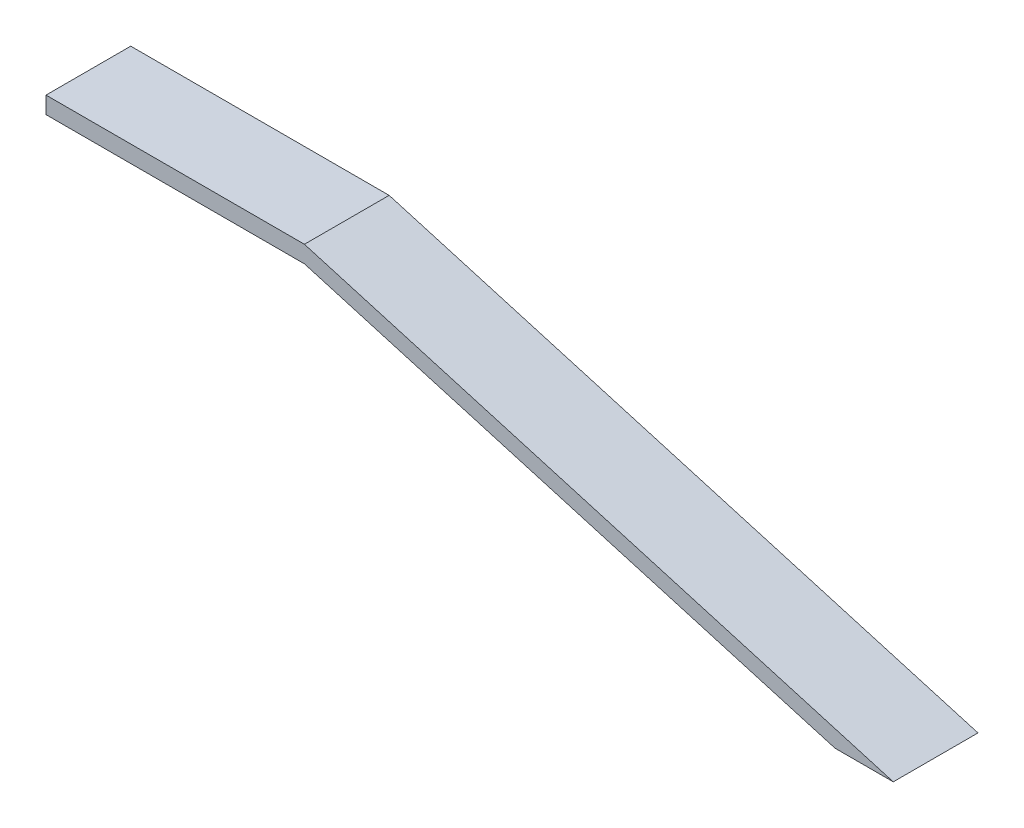
ISO-10303-21;
HEADER;
FILE_DESCRIPTION(('STEP AP214'),'2;1');
FILE_NAME('part.step','',(''),(''),'','','');
FILE_SCHEMA(('AUTOMOTIVE_DESIGN { 1 0 10303 214 1 1 1 1 }'));
ENDSEC;
DATA;
#1=APPLICATION_CONTEXT('core data for automotive mechanical design processes');
#2=APPLICATION_PROTOCOL_DEFINITION('international standard','automotive_design',2000,#1);
#3=PRODUCT_CONTEXT('',#1,'mechanical');
#4=PRODUCT('Part','Part','',(#3));
#5=PRODUCT_RELATED_PRODUCT_CATEGORY('part','',(#4));
#6=PRODUCT_DEFINITION_FORMATION('','',#4);
#7=PRODUCT_DEFINITION_CONTEXT('part definition',#1,'design');
#8=PRODUCT_DEFINITION('design','',#6,#7);
#9=PRODUCT_DEFINITION_SHAPE('','',#8);
#10=(LENGTH_UNIT() NAMED_UNIT(*) SI_UNIT(.MILLI.,.METRE.));
#11=(NAMED_UNIT(*) PLANE_ANGLE_UNIT() SI_UNIT($,.RADIAN.));
#12=(NAMED_UNIT(*) SI_UNIT($,.STERADIAN.) SOLID_ANGLE_UNIT());
#13=UNCERTAINTY_MEASURE_WITH_UNIT(LENGTH_MEASURE(1.E-05),#10,'distance_accuracy_value','');
#14=(GEOMETRIC_REPRESENTATION_CONTEXT(3) GLOBAL_UNCERTAINTY_ASSIGNED_CONTEXT((#13)) GLOBAL_UNIT_ASSIGNED_CONTEXT((#10,
#11,#12)) REPRESENTATION_CONTEXT('',''));
#15=CARTESIAN_POINT('',(0.,0.,0.));
#16=DIRECTION('',(0.,0.,1.));
#17=DIRECTION('',(1.,0.,0.));
#18=AXIS2_PLACEMENT_3D('',#15,#16,#17);
#19=CARTESIAN_POINT('',(-127.,88.9,25.4));
#20=DIRECTION('',(1.,0.,0.));
#21=DIRECTION('',(0.,1.,0.));
#22=AXIS2_PLACEMENT_3D('',#19,#20,#21);
#23=PLANE('',#22);
#24=DIRECTION('',(0.,0.,1.));
#25=VECTOR('',#24,1.);
#26=CARTESIAN_POINT('',(-127.,83.82,0.));
#27=LINE('',#26,#25);
#28=CARTESIAN_POINT('',(-127.,83.82,0.));
#29=VERTEX_POINT('',#28);
#30=CARTESIAN_POINT('',(-127.,83.82,25.4));
#31=VERTEX_POINT('',#30);
#32=EDGE_CURVE('E116',#29,#31,#27,.T.);
#33=ORIENTED_EDGE('',*,*,#32,.T.);
#34=DIRECTION('',(0.,-1.,0.));
#35=VECTOR('',#34,1.);
#36=CARTESIAN_POINT('',(-127.,88.9,25.4));
#37=LINE('',#36,#35);
#38=CARTESIAN_POINT('',(-127.,88.9,25.4));
#39=VERTEX_POINT('',#38);
#40=EDGE_CURVE('E126',#39,#31,#37,.T.);
#41=ORIENTED_EDGE('',*,*,#40,.F.);
#42=DIRECTION('',(0.,0.,-1.));
#43=VECTOR('',#42,1.);
#44=CARTESIAN_POINT('',(-127.,88.9,25.4));
#45=LINE('',#44,#43);
#46=CARTESIAN_POINT('',(-127.,88.9,0.));
#47=VERTEX_POINT('',#46);
#48=EDGE_CURVE('E12',#39,#47,#45,.T.);
#49=ORIENTED_EDGE('',*,*,#48,.T.);
#50=DIRECTION('',(0.,-1.,0.));
#51=VECTOR('',#50,1.);
#52=CARTESIAN_POINT('',(-127.,88.9,0.));
#53=LINE('',#52,#51);
#54=EDGE_CURVE('E128',#47,#29,#53,.T.);
#55=ORIENTED_EDGE('',*,*,#54,.T.);
#56=EDGE_LOOP('',(#33,#41,#49,#55));
#57=FACE_BOUND('',#56,.T.);
#58=ADVANCED_FACE('F60',(#57),#23,.F.);
#59=CARTESIAN_POINT('',(0.,0.,25.4));
#60=DIRECTION('',(0.,0.,-1.));
#61=DIRECTION('',(-1.,0.,0.));
#62=AXIS2_PLACEMENT_3D('',#59,#60,#61);
#63=PLANE('',#62);
#64=DIRECTION('',(1.,0.,0.));
#65=VECTOR('',#64,1.);
#66=CARTESIAN_POINT('',(0.,83.82,25.4));
#67=LINE('',#66,#65);
#68=CARTESIAN_POINT('',(-49.5300000000001,83.82,25.4));
#69=VERTEX_POINT('',#68);
#70=EDGE_CURVE('E113',#31,#69,#67,.T.);
#71=ORIENTED_EDGE('',*,*,#70,.T.);
#72=DIRECTION('',(0.960271404884923,-0.279067785601161,0.));
#73=VECTOR('',#72,1.);
#74=CARTESIAN_POINT('',(18.6048134761154,64.0191068125096,25.4));
#75=LINE('',#74,#73);
#76=CARTESIAN_POINT('',(109.519735388637,37.5980077282665,25.4));
#77=VERTEX_POINT('',#76);
#78=EDGE_CURVE('E129',#69,#77,#75,.T.);
#79=ORIENTED_EDGE('',*,*,#78,.T.);
#80=DIRECTION('',(-1.,0.,0.));
#81=VECTOR('',#80,1.);
#82=CARTESIAN_POINT('',(0.,37.5980077282665,25.4));
#83=LINE('',#82,#81);
#84=CARTESIAN_POINT('',(127.,37.5980077282666,25.4));
#85=VERTEX_POINT('',#84);
#86=EDGE_CURVE('E147',#85,#77,#83,.T.);
#87=ORIENTED_EDGE('',*,*,#86,.F.);
#88=DIRECTION('',(0.960271404884923,-0.279067785601161,0.));
#89=VECTOR('',#88,1.);
#90=CARTESIAN_POINT('',(19.9661560139651,68.7034823613912,25.4));
#91=LINE('',#90,#89);
#92=CARTESIAN_POINT('',(-49.5300000000001,88.9,25.4));
#93=VERTEX_POINT('',#92);
#94=EDGE_CURVE('E144',#93,#85,#91,.T.);
#95=ORIENTED_EDGE('',*,*,#94,.F.);
#96=DIRECTION('',(-1.,0.,0.));
#97=VECTOR('',#96,1.);
#98=CARTESIAN_POINT('',(127.,88.9,25.4));
#99=LINE('',#98,#97);
#100=EDGE_CURVE('E67',#93,#39,#99,.T.);
#101=ORIENTED_EDGE('',*,*,#100,.T.);
#102=ORIENTED_EDGE('',*,*,#40,.T.);
#103=EDGE_LOOP('',(#71,#79,#87,#95,#101,#102));
#104=FACE_BOUND('',#103,.T.);
#105=ADVANCED_FACE('F131',(#104),#63,.F.);
#106=CARTESIAN_POINT('',(0.,0.,0.));
#107=DIRECTION('',(0.,0.,-1.));
#108=DIRECTION('',(-1.,0.,0.));
#109=AXIS2_PLACEMENT_3D('',#106,#107,#108);
#110=PLANE('',#109);
#111=DIRECTION('',(0.960271404884923,-0.279067785601161,0.));
#112=VECTOR('',#111,1.);
#113=CARTESIAN_POINT('',(18.6048134761154,64.0191068125096,0.));
#114=LINE('',#113,#112);
#115=CARTESIAN_POINT('',(-49.5300000000001,83.82,0.));
#116=VERTEX_POINT('',#115);
#117=CARTESIAN_POINT('',(109.519735388637,37.5980077282665,0.));
#118=VERTEX_POINT('',#117);
#119=EDGE_CURVE('E152',#116,#118,#114,.T.);
#120=ORIENTED_EDGE('',*,*,#119,.F.);
#121=DIRECTION('',(1.,0.,0.));
#122=VECTOR('',#121,1.);
#123=CARTESIAN_POINT('',(0.,83.82,0.));
#124=LINE('',#123,#122);
#125=EDGE_CURVE('E154',#29,#116,#124,.T.);
#126=ORIENTED_EDGE('',*,*,#125,.F.);
#127=ORIENTED_EDGE('',*,*,#54,.F.);
#128=DIRECTION('',(-1.,0.,0.));
#129=VECTOR('',#128,1.);
#130=CARTESIAN_POINT('',(127.,88.9,0.));
#131=LINE('',#130,#129);
#132=CARTESIAN_POINT('',(-49.5300000000001,88.9,0.));
#133=VERTEX_POINT('',#132);
#134=EDGE_CURVE('E132',#133,#47,#131,.T.);
#135=ORIENTED_EDGE('',*,*,#134,.F.);
#136=DIRECTION('',(0.960271404884923,-0.279067785601161,0.));
#137=VECTOR('',#136,1.);
#138=CARTESIAN_POINT('',(19.9661560139651,68.7034823613912,0.));
#139=LINE('',#138,#137);
#140=CARTESIAN_POINT('',(127.,37.5980077282666,0.));
#141=VERTEX_POINT('',#140);
#142=EDGE_CURVE('E142',#133,#141,#139,.T.);
#143=ORIENTED_EDGE('',*,*,#142,.T.);
#144=DIRECTION('',(-1.,0.,0.));
#145=VECTOR('',#144,1.);
#146=CARTESIAN_POINT('',(0.,37.5980077282665,0.));
#147=LINE('',#146,#145);
#148=EDGE_CURVE('E74',#141,#118,#147,.T.);
#149=ORIENTED_EDGE('',*,*,#148,.T.);
#150=EDGE_LOOP('',(#120,#126,#127,#135,#143,#149));
#151=FACE_BOUND('',#150,.T.);
#152=ADVANCED_FACE('F170',(#151),#110,.T.);
#153=CARTESIAN_POINT('',(127.,88.9,25.4));
#154=DIRECTION('',(0.,-1.,0.));
#155=DIRECTION('',(1.,0.,0.));
#156=AXIS2_PLACEMENT_3D('',#153,#154,#155);
#157=PLANE('',#156);
#158=ORIENTED_EDGE('',*,*,#100,.F.);
#159=DIRECTION('',(0.,0.,1.));
#160=VECTOR('',#159,1.);
#161=CARTESIAN_POINT('',(-49.5300000000001,88.9,0.));
#162=LINE('',#161,#160);
#163=EDGE_CURVE('E136',#133,#93,#162,.T.);
#164=ORIENTED_EDGE('',*,*,#163,.F.);
#165=ORIENTED_EDGE('',*,*,#134,.T.);
#166=ORIENTED_EDGE('',*,*,#48,.F.);
#167=EDGE_LOOP('',(#158,#164,#165,#166));
#168=FACE_BOUND('',#167,.T.);
#169=ADVANCED_FACE('F168',(#168),#157,.F.);
#170=CARTESIAN_POINT('',(19.9661560139651,68.7034823613912,0.));
#171=DIRECTION('',(-0.279067785601161,-0.960271404884923,0.));
#172=DIRECTION('',(0.960271404884923,-0.279067785601161,0.));
#173=AXIS2_PLACEMENT_3D('',#170,#171,#172);
#174=PLANE('',#173);
#175=ORIENTED_EDGE('',*,*,#94,.T.);
#176=DIRECTION('',(0.,0.,1.));
#177=VECTOR('',#176,1.);
#178=CARTESIAN_POINT('',(127.,37.5980077282666,0.));
#179=LINE('',#178,#177);
#180=EDGE_CURVE('E139',#141,#85,#179,.T.);
#181=ORIENTED_EDGE('',*,*,#180,.F.);
#182=ORIENTED_EDGE('',*,*,#142,.F.);
#183=ORIENTED_EDGE('',*,*,#163,.T.);
#184=EDGE_LOOP('',(#175,#181,#182,#183));
#185=FACE_BOUND('',#184,.T.);
#186=ADVANCED_FACE('F164',(#185),#174,.F.);
#187=CARTESIAN_POINT('',(0.,83.82,0.));
#188=DIRECTION('',(0.,-1.,0.));
#189=DIRECTION('',(0.,0.,-1.));
#190=AXIS2_PLACEMENT_3D('',#187,#188,#189);
#191=PLANE('',#190);
#192=ORIENTED_EDGE('',*,*,#70,.F.);
#193=ORIENTED_EDGE('',*,*,#32,.F.);
#194=ORIENTED_EDGE('',*,*,#125,.T.);
#195=DIRECTION('',(0.,0.,1.));
#196=VECTOR('',#195,1.);
#197=CARTESIAN_POINT('',(-49.5300000000001,83.82,0.));
#198=LINE('',#197,#196);
#199=EDGE_CURVE('E119',#116,#69,#198,.T.);
#200=ORIENTED_EDGE('',*,*,#199,.T.);
#201=EDGE_LOOP('',(#192,#193,#194,#200));
#202=FACE_BOUND('',#201,.T.);
#203=ADVANCED_FACE('F115',(#202),#191,.T.);
#204=CARTESIAN_POINT('',(18.6048134761154,64.0191068125096,0.));
#205=DIRECTION('',(-0.279067785601161,-0.960271404884923,0.));
#206=DIRECTION('',(0.960271404884923,-0.279067785601161,0.));
#207=AXIS2_PLACEMENT_3D('',#204,#205,#206);
#208=PLANE('',#207);
#209=ORIENTED_EDGE('',*,*,#78,.F.);
#210=ORIENTED_EDGE('',*,*,#199,.F.);
#211=ORIENTED_EDGE('',*,*,#119,.T.);
#212=DIRECTION('',(0.,0.,1.));
#213=VECTOR('',#212,1.);
#214=CARTESIAN_POINT('',(109.519735388637,37.5980077282665,0.));
#215=LINE('',#214,#213);
#216=EDGE_CURVE('E151',#118,#77,#215,.T.);
#217=ORIENTED_EDGE('',*,*,#216,.T.);
#218=EDGE_LOOP('',(#209,#210,#211,#217));
#219=FACE_BOUND('',#218,.T.);
#220=ADVANCED_FACE('F160',(#219),#208,.T.);
#221=CARTESIAN_POINT('',(0.,37.5980077282665,0.));
#222=DIRECTION('',(0.,1.,0.));
#223=DIRECTION('',(0.,0.,1.));
#224=AXIS2_PLACEMENT_3D('',#221,#222,#223);
#225=PLANE('',#224);
#226=ORIENTED_EDGE('',*,*,#86,.T.);
#227=ORIENTED_EDGE('',*,*,#216,.F.);
#228=ORIENTED_EDGE('',*,*,#148,.F.);
#229=ORIENTED_EDGE('',*,*,#180,.T.);
#230=EDGE_LOOP('',(#226,#227,#228,#229));
#231=FACE_BOUND('',#230,.T.);
#232=ADVANCED_FACE('F162',(#231),#225,.F.);
#233=CLOSED_SHELL('',(#58,#105,#152,#169,#186,#203,#220,#232));
#234=MANIFOLD_SOLID_BREP('B2',#233);
#235=ADVANCED_BREP_SHAPE_REPRESENTATION('',(#18,#234),#14);
#236=SHAPE_DEFINITION_REPRESENTATION(#9,#235);
ENDSEC;
END-ISO-10303-21;
